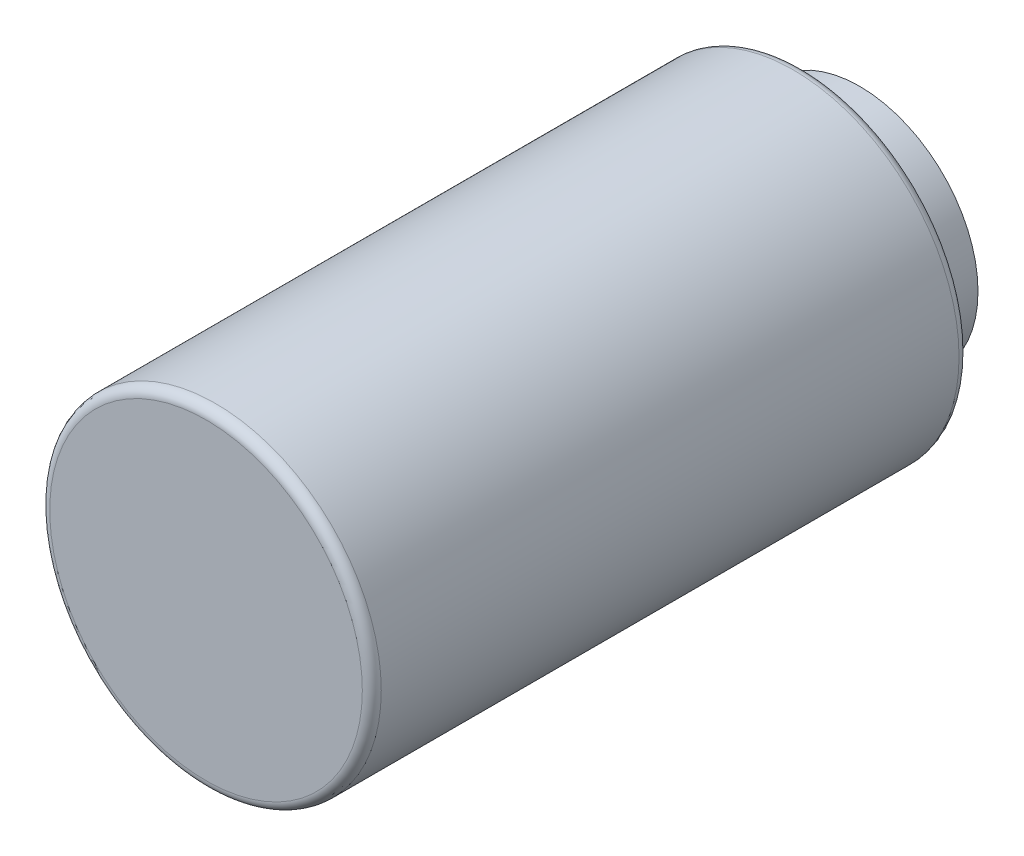
ISO-10303-21;
HEADER;
FILE_DESCRIPTION(('STEP AP214'),'2;1');
FILE_NAME('part.step','',(''),(''),'','','');
FILE_SCHEMA(('AUTOMOTIVE_DESIGN { 1 0 10303 214 1 1 1 1 }'));
ENDSEC;
DATA;
#1=APPLICATION_CONTEXT('core data for automotive mechanical design processes');
#2=APPLICATION_PROTOCOL_DEFINITION('international standard','automotive_design',2000,#1);
#3=PRODUCT_CONTEXT('',#1,'mechanical');
#4=PRODUCT('Part','Part','',(#3));
#5=PRODUCT_RELATED_PRODUCT_CATEGORY('part','',(#4));
#6=PRODUCT_DEFINITION_FORMATION('','',#4);
#7=PRODUCT_DEFINITION_CONTEXT('part definition',#1,'design');
#8=PRODUCT_DEFINITION('design','',#6,#7);
#9=PRODUCT_DEFINITION_SHAPE('','',#8);
#10=(LENGTH_UNIT() NAMED_UNIT(*) SI_UNIT(.MILLI.,.METRE.));
#11=(NAMED_UNIT(*) PLANE_ANGLE_UNIT() SI_UNIT($,.RADIAN.));
#12=(NAMED_UNIT(*) SI_UNIT($,.STERADIAN.) SOLID_ANGLE_UNIT());
#13=UNCERTAINTY_MEASURE_WITH_UNIT(LENGTH_MEASURE(1.E-05),#10,'distance_accuracy_value','');
#14=(GEOMETRIC_REPRESENTATION_CONTEXT(3) GLOBAL_UNCERTAINTY_ASSIGNED_CONTEXT((#13)) GLOBAL_UNIT_ASSIGNED_CONTEXT((#10,
#11,#12)) REPRESENTATION_CONTEXT('',''));
#15=CARTESIAN_POINT('',(0.,0.,0.));
#16=DIRECTION('',(0.,0.,1.));
#17=DIRECTION('',(1.,0.,0.));
#18=AXIS2_PLACEMENT_3D('',#15,#16,#17);
#19=CARTESIAN_POINT('',(0.,0.,0.));
#20=DIRECTION('',(0.,0.,1.));
#21=DIRECTION('',(1.,0.,0.));
#22=AXIS2_PLACEMENT_3D('',#19,#20,#21);
#23=PLANE('',#22);
#24=CARTESIAN_POINT('',(0.,0.,0.));
#25=DIRECTION('',(0.,0.,1.));
#26=DIRECTION('',(1.,0.,0.));
#27=AXIS2_PLACEMENT_3D('',#24,#25,#26);
#28=CIRCLE('',#27,16.5);
#29=CARTESIAN_POINT('',(16.5,0.,0.));
#30=VERTEX_POINT('',#29);
#31=EDGE_CURVE('E37',#30,#30,#28,.F.);
#32=ORIENTED_EDGE('',*,*,#31,.T.);
#33=EDGE_LOOP('',(#32));
#34=FACE_BOUND('',#33,.T.);
#35=CARTESIAN_POINT('',(0.,0.,0.));
#36=DIRECTION('',(0.,0.,1.));
#37=DIRECTION('',(1.,0.,0.));
#38=AXIS2_PLACEMENT_3D('',#35,#36,#37);
#39=CIRCLE('',#38,12.5);
#40=CARTESIAN_POINT('',(12.5,0.,0.));
#41=VERTEX_POINT('',#40);
#42=EDGE_CURVE('E50',#41,#41,#39,.F.);
#43=ORIENTED_EDGE('',*,*,#42,.F.);
#44=EDGE_LOOP('',(#43));
#45=FACE_BOUND('',#44,.T.);
#46=ADVANCED_FACE('F30',(#34,#45),#23,.F.);
#47=CARTESIAN_POINT('',(0.,0.,63.));
#48=DIRECTION('',(0.,0.,-1.));
#49=DIRECTION('',(-1.,0.,0.));
#50=AXIS2_PLACEMENT_3D('',#47,#48,#49);
#51=CYLINDRICAL_SURFACE('',#50,17.5);
#52=CARTESIAN_POINT('',(0.,0.,1.));
#53=DIRECTION('',(0.,0.,1.));
#54=DIRECTION('',(1.,0.,0.));
#55=AXIS2_PLACEMENT_3D('',#52,#53,#54);
#56=CIRCLE('',#55,17.5);
#57=CARTESIAN_POINT('',(17.5,0.,1.));
#58=VERTEX_POINT('',#57);
#59=EDGE_CURVE('E41',#58,#58,#56,.T.);
#60=ORIENTED_EDGE('',*,*,#59,.T.);
#61=EDGE_LOOP('',(#60));
#62=FACE_BOUND('',#61,.T.);
#63=CARTESIAN_POINT('',(0.,0.,62.));
#64=DIRECTION('',(0.,0.,1.));
#65=DIRECTION('',(1.,0.,0.));
#66=AXIS2_PLACEMENT_3D('',#63,#64,#65);
#67=CIRCLE('',#66,17.5);
#68=CARTESIAN_POINT('',(17.5,0.,62.));
#69=VERTEX_POINT('',#68);
#70=EDGE_CURVE('E45',#69,#69,#67,.F.);
#71=ORIENTED_EDGE('',*,*,#70,.T.);
#72=EDGE_LOOP('',(#71));
#73=FACE_BOUND('',#72,.T.);
#74=ADVANCED_FACE('F67',(#62,#73),#51,.T.);
#75=CARTESIAN_POINT('',(0.,0.,63.));
#76=DIRECTION('',(0.,0.,1.));
#77=DIRECTION('',(1.,0.,0.));
#78=AXIS2_PLACEMENT_3D('',#75,#76,#77);
#79=PLANE('',#78);
#80=CARTESIAN_POINT('',(0.,0.,63.));
#81=DIRECTION('',(0.,0.,1.));
#82=DIRECTION('',(1.,0.,0.));
#83=AXIS2_PLACEMENT_3D('',#80,#81,#82);
#84=CIRCLE('',#83,16.5);
#85=CARTESIAN_POINT('',(16.5,0.,63.));
#86=VERTEX_POINT('',#85);
#87=EDGE_CURVE('E10',#86,#86,#84,.T.);
#88=ORIENTED_EDGE('',*,*,#87,.T.);
#89=EDGE_LOOP('',(#88));
#90=FACE_BOUND('',#89,.T.);
#91=ADVANCED_FACE('F62',(#90),#79,.T.);
#92=CARTESIAN_POINT('',(0.,0.,-6.));
#93=DIRECTION('',(0.,0.,1.));
#94=DIRECTION('',(1.,0.,0.));
#95=AXIS2_PLACEMENT_3D('',#92,#93,#94);
#96=CYLINDRICAL_SURFACE('',#95,12.5);
#97=CARTESIAN_POINT('',(0.,0.,-6.));
#98=DIRECTION('',(0.,0.,-1.));
#99=DIRECTION('',(-1.,0.,0.));
#100=AXIS2_PLACEMENT_3D('',#97,#98,#99);
#101=CIRCLE('',#100,12.5);
#102=CARTESIAN_POINT('',(-12.5,0.,-6.));
#103=VERTEX_POINT('',#102);
#104=EDGE_CURVE('E53',#103,#103,#101,.T.);
#105=ORIENTED_EDGE('',*,*,#104,.F.);
#106=EDGE_LOOP('',(#105));
#107=FACE_BOUND('',#106,.T.);
#108=ORIENTED_EDGE('',*,*,#42,.T.);
#109=EDGE_LOOP('',(#108));
#110=FACE_BOUND('',#109,.T.);
#111=ADVANCED_FACE('F59',(#107,#110),#96,.T.);
#112=CARTESIAN_POINT('',(0.,0.,-6.));
#113=DIRECTION('',(0.,0.,-1.));
#114=DIRECTION('',(-1.,0.,0.));
#115=AXIS2_PLACEMENT_3D('',#112,#113,#114);
#116=PLANE('',#115);
#117=ORIENTED_EDGE('',*,*,#104,.T.);
#118=EDGE_LOOP('',(#117));
#119=FACE_BOUND('',#118,.T.);
#120=ADVANCED_FACE('F57',(#119),#116,.T.);
#121=CARTESIAN_POINT('',(0.,0.,1.));
#122=DIRECTION('',(0.,0.,1.));
#123=DIRECTION('',(1.,0.,0.));
#124=AXIS2_PLACEMENT_3D('',#121,#122,#123);
#125=TOROIDAL_SURFACE('',#124,16.5,1.);
#126=ORIENTED_EDGE('',*,*,#31,.F.);
#127=EDGE_LOOP('',(#126));
#128=FACE_BOUND('',#127,.T.);
#129=ORIENTED_EDGE('',*,*,#59,.F.);
#130=EDGE_LOOP('',(#129));
#131=FACE_BOUND('',#130,.T.);
#132=ADVANCED_FACE('F75',(#128,#131),#125,.T.);
#133=CARTESIAN_POINT('',(0.,0.,62.));
#134=DIRECTION('',(0.,0.,1.));
#135=DIRECTION('',(1.,0.,0.));
#136=AXIS2_PLACEMENT_3D('',#133,#134,#135);
#137=TOROIDAL_SURFACE('',#136,16.5,1.);
#138=ORIENTED_EDGE('',*,*,#70,.F.);
#139=EDGE_LOOP('',(#138));
#140=FACE_BOUND('',#139,.T.);
#141=ORIENTED_EDGE('',*,*,#87,.F.);
#142=EDGE_LOOP('',(#141));
#143=FACE_BOUND('',#142,.T.);
#144=ADVANCED_FACE('F32',(#140,#143),#137,.T.);
#145=CLOSED_SHELL('',(#46,#74,#91,#111,#120,#132,#144));
#146=MANIFOLD_SOLID_BREP('B2',#145);
#147=ADVANCED_BREP_SHAPE_REPRESENTATION('',(#18,#146),#14);
#148=SHAPE_DEFINITION_REPRESENTATION(#9,#147);
ENDSEC;
END-ISO-10303-21;
